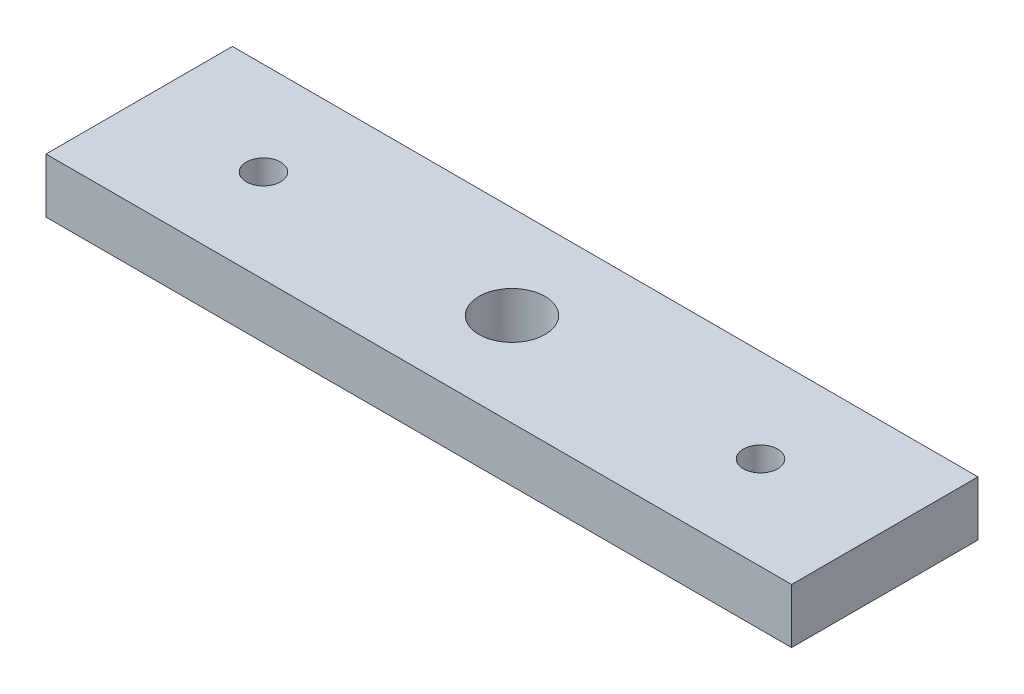
ISO-10303-21;
HEADER;
FILE_DESCRIPTION(('STEP AP214'),'2;1');
FILE_NAME('part.step','',(''),(''),'','','');
FILE_SCHEMA(('AUTOMOTIVE_DESIGN { 1 0 10303 214 1 1 1 1 }'));
ENDSEC;
DATA;
#1=APPLICATION_CONTEXT('core data for automotive mechanical design processes');
#2=APPLICATION_PROTOCOL_DEFINITION('international standard','automotive_design',2000,#1);
#3=PRODUCT_CONTEXT('',#1,'mechanical');
#4=PRODUCT('Part','Part','',(#3));
#5=PRODUCT_RELATED_PRODUCT_CATEGORY('part','',(#4));
#6=PRODUCT_DEFINITION_FORMATION('','',#4);
#7=PRODUCT_DEFINITION_CONTEXT('part definition',#1,'design');
#8=PRODUCT_DEFINITION('design','',#6,#7);
#9=PRODUCT_DEFINITION_SHAPE('','',#8);
#10=(LENGTH_UNIT() NAMED_UNIT(*) SI_UNIT(.MILLI.,.METRE.));
#11=(NAMED_UNIT(*) PLANE_ANGLE_UNIT() SI_UNIT($,.RADIAN.));
#12=(NAMED_UNIT(*) SI_UNIT($,.STERADIAN.) SOLID_ANGLE_UNIT());
#13=UNCERTAINTY_MEASURE_WITH_UNIT(LENGTH_MEASURE(1.E-05),#10,'distance_accuracy_value','');
#14=(GEOMETRIC_REPRESENTATION_CONTEXT(3) GLOBAL_UNCERTAINTY_ASSIGNED_CONTEXT((#13)) GLOBAL_UNIT_ASSIGNED_CONTEXT((#10,
#11,#12)) REPRESENTATION_CONTEXT('',''));
#15=CARTESIAN_POINT('',(0.,0.,0.));
#16=DIRECTION('',(0.,0.,1.));
#17=DIRECTION('',(1.,0.,0.));
#18=AXIS2_PLACEMENT_3D('',#15,#16,#17);
#19=CARTESIAN_POINT('',(38.1,5.588,9.525));
#20=DIRECTION('',(-1.,0.,0.));
#21=DIRECTION('',(0.,0.,1.));
#22=AXIS2_PLACEMENT_3D('',#19,#20,#21);
#23=PLANE('',#22);
#24=DIRECTION('',(0.,0.,-1.));
#25=VECTOR('',#24,1.);
#26=CARTESIAN_POINT('',(38.1,0.,9.525));
#27=LINE('',#26,#25);
#28=CARTESIAN_POINT('',(38.1,0.,9.525));
#29=VERTEX_POINT('',#28);
#30=CARTESIAN_POINT('',(38.1,0.,-9.525));
#31=VERTEX_POINT('',#30);
#32=EDGE_CURVE('E115',#29,#31,#27,.T.);
#33=ORIENTED_EDGE('',*,*,#32,.T.);
#34=DIRECTION('',(0.,-1.,0.));
#35=VECTOR('',#34,1.);
#36=CARTESIAN_POINT('',(38.1,5.588,-9.525));
#37=LINE('',#36,#35);
#38=CARTESIAN_POINT('',(38.1,5.588,-9.525));
#39=VERTEX_POINT('',#38);
#40=EDGE_CURVE('E11',#39,#31,#37,.T.);
#41=ORIENTED_EDGE('',*,*,#40,.F.);
#42=DIRECTION('',(0.,0.,-1.));
#43=VECTOR('',#42,1.);
#44=CARTESIAN_POINT('',(38.1,5.588,9.525));
#45=LINE('',#44,#43);
#46=CARTESIAN_POINT('',(38.1,5.588,9.525));
#47=VERTEX_POINT('',#46);
#48=EDGE_CURVE('E97',#47,#39,#45,.T.);
#49=ORIENTED_EDGE('',*,*,#48,.F.);
#50=DIRECTION('',(0.,-1.,0.));
#51=VECTOR('',#50,1.);
#52=CARTESIAN_POINT('',(38.1,5.588,9.525));
#53=LINE('',#52,#51);
#54=EDGE_CURVE('E111',#47,#29,#53,.T.);
#55=ORIENTED_EDGE('',*,*,#54,.T.);
#56=EDGE_LOOP('',(#33,#41,#49,#55));
#57=FACE_BOUND('',#56,.T.);
#58=ADVANCED_FACE('F40',(#57),#23,.F.);
#59=CARTESIAN_POINT('',(-38.1,5.588,-9.525));
#60=DIRECTION('',(0.,0.,1.));
#61=DIRECTION('',(1.,0.,0.));
#62=AXIS2_PLACEMENT_3D('',#59,#60,#61);
#63=PLANE('',#62);
#64=DIRECTION('',(-1.,0.,0.));
#65=VECTOR('',#64,1.);
#66=CARTESIAN_POINT('',(-38.1,0.,-9.525));
#67=LINE('',#66,#65);
#68=CARTESIAN_POINT('',(-38.1,0.,-9.525));
#69=VERTEX_POINT('',#68);
#70=EDGE_CURVE('E102',#31,#69,#67,.T.);
#71=ORIENTED_EDGE('',*,*,#70,.T.);
#72=DIRECTION('',(0.,-1.,0.));
#73=VECTOR('',#72,1.);
#74=CARTESIAN_POINT('',(-38.1,5.588,-9.525));
#75=LINE('',#74,#73);
#76=CARTESIAN_POINT('',(-38.1,5.588,-9.525));
#77=VERTEX_POINT('',#76);
#78=EDGE_CURVE('E49',#77,#69,#75,.T.);
#79=ORIENTED_EDGE('',*,*,#78,.F.);
#80=DIRECTION('',(-1.,0.,0.));
#81=VECTOR('',#80,1.);
#82=CARTESIAN_POINT('',(-38.1,5.588,-9.525));
#83=LINE('',#82,#81);
#84=EDGE_CURVE('E92',#39,#77,#83,.T.);
#85=ORIENTED_EDGE('',*,*,#84,.F.);
#86=ORIENTED_EDGE('',*,*,#40,.T.);
#87=EDGE_LOOP('',(#71,#79,#85,#86));
#88=FACE_BOUND('',#87,.T.);
#89=ADVANCED_FACE('F101',(#88),#63,.F.);
#90=CARTESIAN_POINT('',(-38.1,5.588,9.525));
#91=DIRECTION('',(1.,0.,0.));
#92=DIRECTION('',(0.,0.,-1.));
#93=AXIS2_PLACEMENT_3D('',#90,#91,#92);
#94=PLANE('',#93);
#95=DIRECTION('',(0.,0.,1.));
#96=VECTOR('',#95,1.);
#97=CARTESIAN_POINT('',(-38.1,0.,9.525));
#98=LINE('',#97,#96);
#99=CARTESIAN_POINT('',(-38.1,0.,9.525));
#100=VERTEX_POINT('',#99);
#101=EDGE_CURVE('E79',#69,#100,#98,.T.);
#102=ORIENTED_EDGE('',*,*,#101,.T.);
#103=DIRECTION('',(0.,-1.,0.));
#104=VECTOR('',#103,1.);
#105=CARTESIAN_POINT('',(-38.1,5.588,9.525));
#106=LINE('',#105,#104);
#107=CARTESIAN_POINT('',(-38.1,5.588,9.525));
#108=VERTEX_POINT('',#107);
#109=EDGE_CURVE('E104',#108,#100,#106,.T.);
#110=ORIENTED_EDGE('',*,*,#109,.F.);
#111=DIRECTION('',(0.,0.,1.));
#112=VECTOR('',#111,1.);
#113=CARTESIAN_POINT('',(-38.1,5.588,9.525));
#114=LINE('',#113,#112);
#115=EDGE_CURVE('E95',#77,#108,#114,.T.);
#116=ORIENTED_EDGE('',*,*,#115,.F.);
#117=ORIENTED_EDGE('',*,*,#78,.T.);
#118=EDGE_LOOP('',(#102,#110,#116,#117));
#119=FACE_BOUND('',#118,.T.);
#120=ADVANCED_FACE('F106',(#119),#94,.F.);
#121=CARTESIAN_POINT('',(-38.1,5.588,9.525));
#122=DIRECTION('',(0.,0.,-1.));
#123=DIRECTION('',(-1.,0.,0.));
#124=AXIS2_PLACEMENT_3D('',#121,#122,#123);
#125=PLANE('',#124);
#126=DIRECTION('',(1.,0.,0.));
#127=VECTOR('',#126,1.);
#128=CARTESIAN_POINT('',(-38.1,0.,9.525));
#129=LINE('',#128,#127);
#130=EDGE_CURVE('E85',#100,#29,#129,.T.);
#131=ORIENTED_EDGE('',*,*,#130,.T.);
#132=ORIENTED_EDGE('',*,*,#54,.F.);
#133=DIRECTION('',(1.,0.,0.));
#134=VECTOR('',#133,1.);
#135=CARTESIAN_POINT('',(-38.1,5.588,9.525));
#136=LINE('',#135,#134);
#137=EDGE_CURVE('E59',#108,#47,#136,.T.);
#138=ORIENTED_EDGE('',*,*,#137,.F.);
#139=ORIENTED_EDGE('',*,*,#109,.T.);
#140=EDGE_LOOP('',(#131,#132,#138,#139));
#141=FACE_BOUND('',#140,.T.);
#142=ADVANCED_FACE('F126',(#141),#125,.F.);
#143=CARTESIAN_POINT('',(0.,5.588,0.));
#144=DIRECTION('',(0.,-1.,0.));
#145=DIRECTION('',(0.,0.,-1.));
#146=AXIS2_PLACEMENT_3D('',#143,#144,#145);
#147=PLANE('',#146);
#148=CARTESIAN_POINT('',(25.4,5.588,0.));
#149=DIRECTION('',(0.,1.,0.));
#150=DIRECTION('',(0.,0.,1.));
#151=AXIS2_PLACEMENT_3D('',#148,#149,#150);
#152=CIRCLE('',#151,1.75259999999999);
#153=CARTESIAN_POINT('',(25.4,5.588,1.75259999999999));
#154=VERTEX_POINT('',#153);
#155=EDGE_CURVE('E148',#154,#154,#152,.T.);
#156=ORIENTED_EDGE('',*,*,#155,.F.);
#157=EDGE_LOOP('',(#156));
#158=FACE_BOUND('',#157,.T.);
#159=CARTESIAN_POINT('',(-25.4,5.588,0.));
#160=DIRECTION('',(0.,1.,0.));
#161=DIRECTION('',(0.,0.,1.));
#162=AXIS2_PLACEMENT_3D('',#159,#160,#161);
#163=CIRCLE('',#162,1.75259999999999);
#164=CARTESIAN_POINT('',(-25.4,5.588,1.75259999999999));
#165=VERTEX_POINT('',#164);
#166=EDGE_CURVE('E140',#165,#165,#163,.T.);
#167=ORIENTED_EDGE('',*,*,#166,.F.);
#168=EDGE_LOOP('',(#167));
#169=FACE_BOUND('',#168,.T.);
#170=CARTESIAN_POINT('',(0.,5.588,0.));
#171=DIRECTION('',(0.,1.,0.));
#172=DIRECTION('',(0.,0.,1.));
#173=AXIS2_PLACEMENT_3D('',#170,#171,#172);
#174=CIRCLE('',#173,3.3782);
#175=CARTESIAN_POINT('',(0.,5.588,3.3782));
#176=VERTEX_POINT('',#175);
#177=EDGE_CURVE('E132',#176,#176,#174,.T.);
#178=ORIENTED_EDGE('',*,*,#177,.F.);
#179=EDGE_LOOP('',(#178));
#180=FACE_BOUND('',#179,.T.);
#181=ORIENTED_EDGE('',*,*,#48,.T.);
#182=ORIENTED_EDGE('',*,*,#84,.T.);
#183=ORIENTED_EDGE('',*,*,#115,.T.);
#184=ORIENTED_EDGE('',*,*,#137,.T.);
#185=EDGE_LOOP('',(#181,#182,#183,#184));
#186=FACE_BOUND('',#185,.T.);
#187=ADVANCED_FACE('F93',(#158,#169,#180,#186),#147,.F.);
#188=CARTESIAN_POINT('',(0.,0.,0.));
#189=DIRECTION('',(0.,-1.,0.));
#190=DIRECTION('',(0.,0.,-1.));
#191=AXIS2_PLACEMENT_3D('',#188,#189,#190);
#192=PLANE('',#191);
#193=CARTESIAN_POINT('',(25.4,0.,0.));
#194=DIRECTION('',(0.,-1.,0.));
#195=DIRECTION('',(0.,0.,-1.));
#196=AXIS2_PLACEMENT_3D('',#193,#194,#195);
#197=CIRCLE('',#196,1.75259999999999);
#198=CARTESIAN_POINT('',(25.4,0.,-1.75259999999999));
#199=VERTEX_POINT('',#198);
#200=EDGE_CURVE('E144',#199,#199,#197,.T.);
#201=ORIENTED_EDGE('',*,*,#200,.F.);
#202=EDGE_LOOP('',(#201));
#203=FACE_BOUND('',#202,.T.);
#204=CARTESIAN_POINT('',(-25.4,0.,0.));
#205=DIRECTION('',(0.,-1.,0.));
#206=DIRECTION('',(0.,0.,-1.));
#207=AXIS2_PLACEMENT_3D('',#204,#205,#206);
#208=CIRCLE('',#207,1.75259999999999);
#209=CARTESIAN_POINT('',(-25.4,0.,-1.75259999999999));
#210=VERTEX_POINT('',#209);
#211=EDGE_CURVE('E136',#210,#210,#208,.T.);
#212=ORIENTED_EDGE('',*,*,#211,.F.);
#213=EDGE_LOOP('',(#212));
#214=FACE_BOUND('',#213,.T.);
#215=CARTESIAN_POINT('',(0.,0.,0.));
#216=DIRECTION('',(0.,-1.,0.));
#217=DIRECTION('',(0.,0.,-1.));
#218=AXIS2_PLACEMENT_3D('',#215,#216,#217);
#219=CIRCLE('',#218,3.3782);
#220=CARTESIAN_POINT('',(0.,0.,-3.3782));
#221=VERTEX_POINT('',#220);
#222=EDGE_CURVE('E43',#221,#221,#219,.T.);
#223=ORIENTED_EDGE('',*,*,#222,.F.);
#224=EDGE_LOOP('',(#223));
#225=FACE_BOUND('',#224,.T.);
#226=ORIENTED_EDGE('',*,*,#32,.F.);
#227=ORIENTED_EDGE('',*,*,#130,.F.);
#228=ORIENTED_EDGE('',*,*,#101,.F.);
#229=ORIENTED_EDGE('',*,*,#70,.F.);
#230=EDGE_LOOP('',(#226,#227,#228,#229));
#231=FACE_BOUND('',#230,.T.);
#232=ADVANCED_FACE('F129',(#203,#214,#225,#231),#192,.T.);
#233=CARTESIAN_POINT('',(0.,5.588,0.));
#234=DIRECTION('',(0.,1.,0.));
#235=DIRECTION('',(0.,0.,1.));
#236=AXIS2_PLACEMENT_3D('',#233,#234,#235);
#237=CYLINDRICAL_SURFACE('',#236,3.3782);
#238=ORIENTED_EDGE('',*,*,#222,.T.);
#239=EDGE_LOOP('',(#238));
#240=FACE_BOUND('',#239,.T.);
#241=ORIENTED_EDGE('',*,*,#177,.T.);
#242=EDGE_LOOP('',(#241));
#243=FACE_BOUND('',#242,.T.);
#244=ADVANCED_FACE('F163',(#240,#243),#237,.F.);
#245=CARTESIAN_POINT('',(-25.4,5.588,0.));
#246=DIRECTION('',(0.,1.,0.));
#247=DIRECTION('',(0.,0.,1.));
#248=AXIS2_PLACEMENT_3D('',#245,#246,#247);
#249=CYLINDRICAL_SURFACE('',#248,1.75259999999999);
#250=ORIENTED_EDGE('',*,*,#166,.T.);
#251=EDGE_LOOP('',(#250));
#252=FACE_BOUND('',#251,.T.);
#253=ORIENTED_EDGE('',*,*,#211,.T.);
#254=EDGE_LOOP('',(#253));
#255=FACE_BOUND('',#254,.T.);
#256=ADVANCED_FACE('F165',(#252,#255),#249,.F.);
#257=CARTESIAN_POINT('',(25.4,5.588,0.));
#258=DIRECTION('',(0.,1.,0.));
#259=DIRECTION('',(0.,0.,1.));
#260=AXIS2_PLACEMENT_3D('',#257,#258,#259);
#261=CYLINDRICAL_SURFACE('',#260,1.75259999999999);
#262=ORIENTED_EDGE('',*,*,#155,.T.);
#263=EDGE_LOOP('',(#262));
#264=FACE_BOUND('',#263,.T.);
#265=ORIENTED_EDGE('',*,*,#200,.T.);
#266=EDGE_LOOP('',(#265));
#267=FACE_BOUND('',#266,.T.);
#268=ADVANCED_FACE('F153',(#264,#267),#261,.F.);
#269=CLOSED_SHELL('',(#58,#89,#120,#142,#187,#232,#244,#256,#268));
#270=MANIFOLD_SOLID_BREP('B2',#269);
#271=ADVANCED_BREP_SHAPE_REPRESENTATION('',(#18,#270),#14);
#272=SHAPE_DEFINITION_REPRESENTATION(#9,#271);
ENDSEC;
END-ISO-10303-21;
